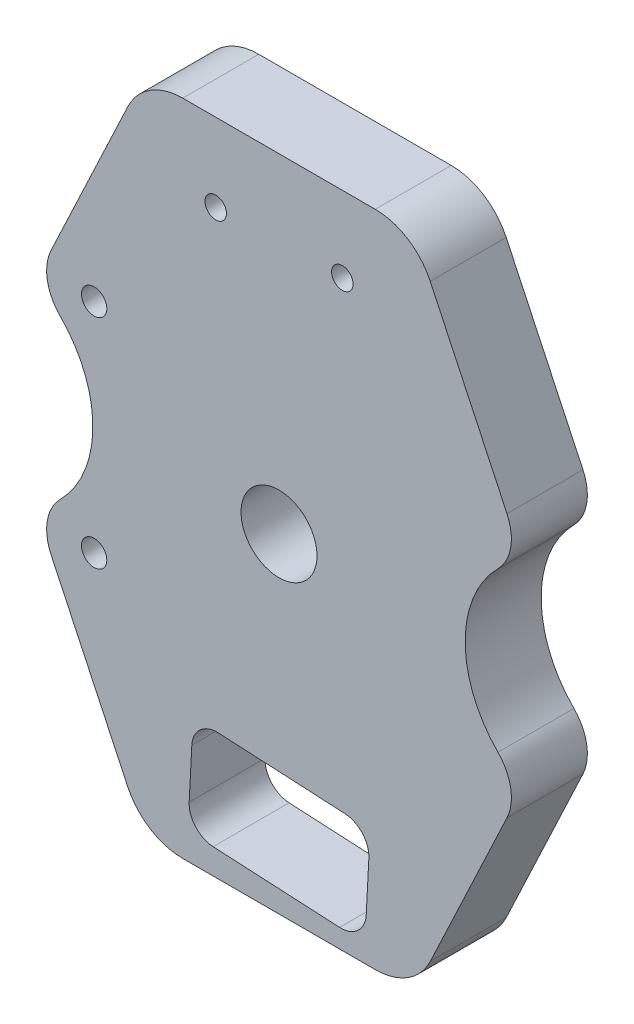
ISO-10303-21;
HEADER;
FILE_DESCRIPTION(('STEP AP214'),'2;1');
FILE_NAME('part.step','',(''),(''),'','','');
FILE_SCHEMA(('AUTOMOTIVE_DESIGN { 1 0 10303 214 1 1 1 1 }'));
ENDSEC;
DATA;
#1=APPLICATION_CONTEXT('core data for automotive mechanical design processes');
#2=APPLICATION_PROTOCOL_DEFINITION('international standard','automotive_design',2000,#1);
#3=PRODUCT_CONTEXT('',#1,'mechanical');
#4=PRODUCT('Part','Part','',(#3));
#5=PRODUCT_RELATED_PRODUCT_CATEGORY('part','',(#4));
#6=PRODUCT_DEFINITION_FORMATION('','',#4);
#7=PRODUCT_DEFINITION_CONTEXT('part definition',#1,'design');
#8=PRODUCT_DEFINITION('design','',#6,#7);
#9=PRODUCT_DEFINITION_SHAPE('','',#8);
#10=(LENGTH_UNIT() NAMED_UNIT(*) SI_UNIT(.MILLI.,.METRE.));
#11=(NAMED_UNIT(*) PLANE_ANGLE_UNIT() SI_UNIT($,.RADIAN.));
#12=(NAMED_UNIT(*) SI_UNIT($,.STERADIAN.) SOLID_ANGLE_UNIT());
#13=UNCERTAINTY_MEASURE_WITH_UNIT(LENGTH_MEASURE(1.E-05),#10,'distance_accuracy_value','');
#14=(GEOMETRIC_REPRESENTATION_CONTEXT(3) GLOBAL_UNCERTAINTY_ASSIGNED_CONTEXT((#13)) GLOBAL_UNIT_ASSIGNED_CONTEXT((#10,
#11,#12)) REPRESENTATION_CONTEXT('',''));
#15=CARTESIAN_POINT('',(0.,0.,0.));
#16=DIRECTION('',(0.,0.,1.));
#17=DIRECTION('',(1.,0.,0.));
#18=AXIS2_PLACEMENT_3D('',#15,#16,#17);
#19=CARTESIAN_POINT('',(38.0693004201398,23.9998999467089,30.));
#20=DIRECTION('',(0.,0.,-1.));
#21=DIRECTION('',(-1.,0.,0.));
#22=AXIS2_PLACEMENT_3D('',#19,#20,#21);
#23=PLANE('',#22);
#24=DIRECTION('',(-0.998629534754574,0.0523359562429441,0.));
#25=VECTOR('',#24,1.);
#26=CARTESIAN_POINT('',(-35.998752841269,10.5489732913392,30.));
#27=LINE('',#26,#25);
#28=CARTESIAN_POINT('',(23.9190192440055,7.4088159167626,30.));
#29=VERTEX_POINT('',#28);
#30=CARTESIAN_POINT('',(-26.0124574937233,10.0256137289098,30.));
#31=VERTEX_POINT('',#30);
#32=EDGE_CURVE('E373',#29,#31,#27,.T.);
#33=ORIENTED_EDGE('',*,*,#32,.T.);
#34=CARTESIAN_POINT('',(-25.4890979312938,20.0119090764555,30.));
#35=DIRECTION('',(0.,0.,-1.));
#36=DIRECTION('',(-1.,0.,0.));
#37=AXIS2_PLACEMENT_3D('',#34,#35,#36);
#38=CIRCLE('',#37,10.);
#39=CARTESIAN_POINT('',(-35.4753932788395,20.535268638885,30.));
#40=VERTEX_POINT('',#39);
#41=EDGE_CURVE('E346',#31,#40,#38,.T.);
#42=ORIENTED_EDGE('',*,*,#41,.T.);
#43=DIRECTION('',(0.0523359562429445,0.998629534754574,0.));
#44=VECTOR('',#43,1.);
#45=CARTESIAN_POINT('',(-33.9053145915512,50.4941546815222,30.));
#46=LINE('',#45,#44);
#47=CARTESIAN_POINT('',(-34.4286741539807,40.5078593339764,30.));
#48=VERTEX_POINT('',#47);
#49=EDGE_CURVE('E375',#40,#48,#46,.T.);
#50=ORIENTED_EDGE('',*,*,#49,.T.);
#51=CARTESIAN_POINT('',(-24.4423788064349,39.984499771547,30.));
#52=DIRECTION('',(0.,0.,-1.));
#53=DIRECTION('',(-1.,0.,0.));
#54=AXIS2_PLACEMENT_3D('',#51,#52,#53);
#55=CIRCLE('',#54,10.);
#56=CARTESIAN_POINT('',(-23.9190192440055,49.9707951190927,30.));
#57=VERTEX_POINT('',#56);
#58=EDGE_CURVE('E54',#48,#57,#55,.T.);
#59=ORIENTED_EDGE('',*,*,#58,.T.);
#60=DIRECTION('',(0.998629534754574,-0.0523359562429446,0.));
#61=VECTOR('',#60,1.);
#62=CARTESIAN_POINT('',(35.998752841269,46.830637744516,30.));
#63=LINE('',#62,#61);
#64=CARTESIAN_POINT('',(26.0124574937232,47.3539973069455,30.));
#65=VERTEX_POINT('',#64);
#66=EDGE_CURVE('E369',#57,#65,#63,.T.);
#67=ORIENTED_EDGE('',*,*,#66,.T.);
#68=CARTESIAN_POINT('',(25.4890979312938,37.3677019593998,30.));
#69=DIRECTION('',(0.,0.,-1.));
#70=DIRECTION('',(-1.,0.,0.));
#71=AXIS2_PLACEMENT_3D('',#68,#69,#70);
#72=CIRCLE('',#71,10.);
#73=CARTESIAN_POINT('',(35.4753932788395,36.8443423969703,30.));
#74=VERTEX_POINT('',#73);
#75=EDGE_CURVE('E11',#65,#74,#72,.T.);
#76=ORIENTED_EDGE('',*,*,#75,.T.);
#77=DIRECTION('',(-0.0523359562429445,-0.998629534754574,0.));
#78=VECTOR('',#77,1.);
#79=CARTESIAN_POINT('',(35.998752841269,46.830637744516,30.));
#80=LINE('',#79,#78);
#81=CARTESIAN_POINT('',(34.4286741539806,16.8717517018789,30.));
#82=VERTEX_POINT('',#81);
#83=EDGE_CURVE('E367',#74,#82,#80,.T.);
#84=ORIENTED_EDGE('',*,*,#83,.T.);
#85=CARTESIAN_POINT('',(24.4423788064349,17.3951112643083,30.));
#86=DIRECTION('',(0.,0.,-1.));
#87=DIRECTION('',(-1.,0.,0.));
#88=AXIS2_PLACEMENT_3D('',#85,#86,#87);
#89=CIRCLE('',#88,10.);
#90=EDGE_CURVE('E342',#82,#29,#89,.T.);
#91=ORIENTED_EDGE('',*,*,#90,.T.);
#92=EDGE_LOOP('',(#33,#42,#50,#59,#67,#76,#84,#91));
#93=FACE_BOUND('',#92,.T.);
#94=DIRECTION('',(1.,-1.29580053179329E-13,0.));
#95=VECTOR('',#94,1.);
#96=CARTESIAN_POINT('',(-38.,4.92404202081449E-12,30.));
#97=LINE('',#96,#95);
#98=CARTESIAN_POINT('',(-38.,5.25274268525777E-12,30.));
#99=VERTEX_POINT('',#98);
#100=CARTESIAN_POINT('',(38.0000000000001,5.61581336988582E-12,30.));
#101=VERTEX_POINT('',#100);
#102=EDGE_CURVE('E193',#99,#101,#97,.T.);
#103=ORIENTED_EDGE('',*,*,#102,.T.);
#104=CARTESIAN_POINT('',(38.0693004201398,23.9998999467089,30.));
#105=DIRECTION('',(0.,0.,1.));
#106=DIRECTION('',(-1.,0.,0.));
#107=AXIS2_PLACEMENT_3D('',#104,#105,#106);
#108=CIRCLE('',#107,24.);
#109=CARTESIAN_POINT('',(59.7661609006696,13.7409406774445,30.));
#110=VERTEX_POINT('',#109);
#111=EDGE_CURVE('E197',#101,#110,#108,.T.);
#112=ORIENTED_EDGE('',*,*,#111,.T.);
#113=DIRECTION('',(0.426346779523004,0.904559795475326,0.));
#114=VECTOR('',#113,1.);
#115=CARTESIAN_POINT('',(59.7661609006696,13.7409406774445,30.));
#116=LINE('',#115,#114);
#117=CARTESIAN_POINT('',(90.0082162674247,77.904079068946,30.));
#118=VERTEX_POINT('',#117);
#119=EDGE_CURVE('E218',#110,#118,#116,.T.);
#120=ORIENTED_EDGE('',*,*,#119,.T.);
#121=CARTESIAN_POINT('',(73.5,85.6849077952408,30.));
#122=DIRECTION('',(0.,0.,1.));
#123=DIRECTION('',(-1.,0.,0.));
#124=AXIS2_PLACEMENT_3D('',#121,#122,#123);
#125=CIRCLE('',#124,18.25);
#126=CARTESIAN_POINT('',(86.4422244101156,98.5519714586494,30.));
#127=VERTEX_POINT('',#126);
#128=EDGE_CURVE('E220',#118,#127,#125,.T.);
#129=ORIENTED_EDGE('',*,*,#128,.T.);
#130=CARTESIAN_POINT('',(117.999977081356,129.926455459837,30.));
#131=DIRECTION('',(0.,0.,-1.));
#132=DIRECTION('',(1.,0.,0.));
#133=AXIS2_PLACEMENT_3D('',#130,#131,#132);
#134=CIRCLE('',#133,44.5);
#135=CARTESIAN_POINT('',(86.4422244101156,161.300939461025,30.));
#136=VERTEX_POINT('',#135);
#137=EDGE_CURVE('E225',#127,#136,#134,.T.);
#138=ORIENTED_EDGE('',*,*,#137,.T.);
#139=CARTESIAN_POINT('',(73.5,174.168003124434,30.));
#140=DIRECTION('',(0.,0.,1.));
#141=DIRECTION('',(1.,0.,0.));
#142=AXIS2_PLACEMENT_3D('',#139,#140,#141);
#143=CIRCLE('',#142,18.25);
#144=CARTESIAN_POINT('',(90.0082162674247,181.948831850729,30.));
#145=VERTEX_POINT('',#144);
#146=EDGE_CURVE('E227',#136,#145,#143,.T.);
#147=ORIENTED_EDGE('',*,*,#146,.T.);
#148=DIRECTION('',(-0.426346779523004,0.904559795475326,0.));
#149=VECTOR('',#148,1.);
#150=CARTESIAN_POINT('',(59.7094350914078,246.232322708552,30.));
#151=LINE('',#150,#149);
#152=CARTESIAN_POINT('',(59.7094350914078,246.232322708552,30.));
#153=VERTEX_POINT('',#152);
#154=EDGE_CURVE('E229',#145,#153,#151,.T.);
#155=ORIENTED_EDGE('',*,*,#154,.T.);
#156=CARTESIAN_POINT('',(38.,236.,30.));
#157=DIRECTION('',(0.,0.,1.));
#158=DIRECTION('',(1.,0.,0.));
#159=AXIS2_PLACEMENT_3D('',#156,#157,#158);
#160=CIRCLE('',#159,24.);
#161=CARTESIAN_POINT('',(38.,260.,30.));
#162=VERTEX_POINT('',#161);
#163=EDGE_CURVE('E231',#153,#162,#160,.T.);
#164=ORIENTED_EDGE('',*,*,#163,.T.);
#165=DIRECTION('',(-1.,0.,0.));
#166=VECTOR('',#165,1.);
#167=CARTESIAN_POINT('',(-38.,260.,30.));
#168=LINE('',#167,#166);
#169=CARTESIAN_POINT('',(-38.,260.,30.));
#170=VERTEX_POINT('',#169);
#171=EDGE_CURVE('E233',#162,#170,#168,.T.);
#172=ORIENTED_EDGE('',*,*,#171,.T.);
#173=CARTESIAN_POINT('',(-38.,236.,30.));
#174=DIRECTION('',(0.,0.,1.));
#175=DIRECTION('',(-1.,0.,0.));
#176=AXIS2_PLACEMENT_3D('',#173,#174,#175);
#177=CIRCLE('',#176,24.);
#178=CARTESIAN_POINT('',(-59.7094350914078,246.232322708552,30.));
#179=VERTEX_POINT('',#178);
#180=EDGE_CURVE('E235',#170,#179,#177,.T.);
#181=ORIENTED_EDGE('',*,*,#180,.T.);
#182=DIRECTION('',(-0.426346779523004,-0.904559795475326,0.));
#183=VECTOR('',#182,1.);
#184=CARTESIAN_POINT('',(-59.7094350914078,246.232322708552,30.));
#185=LINE('',#184,#183);
#186=CARTESIAN_POINT('',(-90.0082162674247,181.948831850729,30.));
#187=VERTEX_POINT('',#186);
#188=EDGE_CURVE('E237',#179,#187,#185,.T.);
#189=ORIENTED_EDGE('',*,*,#188,.T.);
#190=CARTESIAN_POINT('',(-73.5,174.168003124434,30.));
#191=DIRECTION('',(0.,0.,1.));
#192=DIRECTION('',(-1.,0.,0.));
#193=AXIS2_PLACEMENT_3D('',#190,#191,#192);
#194=CIRCLE('',#193,18.25);
#195=CARTESIAN_POINT('',(-86.4422244101156,161.300939461025,30.));
#196=VERTEX_POINT('',#195);
#197=EDGE_CURVE('E239',#187,#196,#194,.T.);
#198=ORIENTED_EDGE('',*,*,#197,.T.);
#199=CARTESIAN_POINT('',(-117.999977081356,129.926455459837,30.));
#200=DIRECTION('',(0.,0.,-1.));
#201=DIRECTION('',(-1.,0.,0.));
#202=AXIS2_PLACEMENT_3D('',#199,#200,#201);
#203=CIRCLE('',#202,44.5);
#204=CARTESIAN_POINT('',(-86.4422244101156,98.5519714586494,30.));
#205=VERTEX_POINT('',#204);
#206=EDGE_CURVE('E241',#196,#205,#203,.T.);
#207=ORIENTED_EDGE('',*,*,#206,.T.);
#208=CARTESIAN_POINT('',(-73.5,85.6849077952408,30.));
#209=DIRECTION('',(0.,0.,1.));
#210=DIRECTION('',(1.,0.,0.));
#211=AXIS2_PLACEMENT_3D('',#208,#209,#210);
#212=CIRCLE('',#211,18.25);
#213=CARTESIAN_POINT('',(-90.0082162674247,77.904079068946,30.));
#214=VERTEX_POINT('',#213);
#215=EDGE_CURVE('E243',#205,#214,#212,.T.);
#216=ORIENTED_EDGE('',*,*,#215,.T.);
#217=DIRECTION('',(0.426346779523004,-0.904559795475326,0.));
#218=VECTOR('',#217,1.);
#219=CARTESIAN_POINT('',(-59.7661609006695,13.7409406774445,30.));
#220=LINE('',#219,#218);
#221=CARTESIAN_POINT('',(-59.7661609006695,13.7409406774445,30.));
#222=VERTEX_POINT('',#221);
#223=EDGE_CURVE('E245',#214,#222,#220,.T.);
#224=ORIENTED_EDGE('',*,*,#223,.T.);
#225=CARTESIAN_POINT('',(-38.0693004201397,23.9998999467089,30.));
#226=DIRECTION('',(0.,0.,1.));
#227=DIRECTION('',(1.,0.,0.));
#228=AXIS2_PLACEMENT_3D('',#225,#226,#227);
#229=CIRCLE('',#228,24.0000000000003);
#230=EDGE_CURVE('E200',#222,#99,#229,.T.);
#231=ORIENTED_EDGE('',*,*,#230,.T.);
#232=EDGE_LOOP('',(#103,#112,#120,#129,#138,#147,#155,#164,#172,#181,#189,#198,#207,#216,#224,#231));
#233=FACE_BOUND('',#232,.T.);
#234=CARTESIAN_POINT('',(0.,130.,30.));
#235=DIRECTION('',(0.,0.,1.));
#236=DIRECTION('',(1.,0.,0.));
#237=AXIS2_PLACEMENT_3D('',#234,#235,#236);
#238=CIRCLE('',#237,15.);
#239=CARTESIAN_POINT('',(15.,130.,30.));
#240=VERTEX_POINT('',#239);
#241=EDGE_CURVE('E251',#240,#240,#238,.T.);
#242=ORIENTED_EDGE('',*,*,#241,.F.);
#243=EDGE_LOOP('',(#242));
#244=FACE_BOUND('',#243,.T.);
#245=CARTESIAN_POINT('',(-73.,173.,30.));
#246=DIRECTION('',(0.,0.,1.));
#247=DIRECTION('',(-1.,0.,0.));
#248=AXIS2_PLACEMENT_3D('',#245,#246,#247);
#249=CIRCLE('',#248,5.00000000000001);
#250=CARTESIAN_POINT('',(-78.,173.,30.));
#251=VERTEX_POINT('',#250);
#252=EDGE_CURVE('E406',#251,#251,#249,.T.);
#253=ORIENTED_EDGE('',*,*,#252,.F.);
#254=EDGE_LOOP('',(#253));
#255=FACE_BOUND('',#254,.T.);
#256=CARTESIAN_POINT('',(-73.,87.,30.));
#257=DIRECTION('',(0.,0.,1.));
#258=DIRECTION('',(1.,0.,0.));
#259=AXIS2_PLACEMENT_3D('',#256,#257,#258);
#260=CIRCLE('',#259,5.00000000000001);
#261=CARTESIAN_POINT('',(-68.,87.,30.));
#262=VERTEX_POINT('',#261);
#263=EDGE_CURVE('E400',#262,#262,#260,.T.);
#264=ORIENTED_EDGE('',*,*,#263,.F.);
#265=EDGE_LOOP('',(#264));
#266=FACE_BOUND('',#265,.T.);
#267=CARTESIAN_POINT('',(-24.9923847578196,229.127379678136,30.));
#268=DIRECTION('',(0.,0.,1.));
#269=DIRECTION('',(1.,0.,0.));
#270=AXIS2_PLACEMENT_3D('',#267,#268,#269);
#271=CIRCLE('',#270,4.25);
#272=CARTESIAN_POINT('',(-20.7423847578196,229.127379678136,30.));
#273=VERTEX_POINT('',#272);
#274=EDGE_CURVE('E394',#273,#273,#271,.T.);
#275=ORIENTED_EDGE('',*,*,#274,.F.);
#276=EDGE_LOOP('',(#275));
#277=FACE_BOUND('',#276,.T.);
#278=CARTESIAN_POINT('',(25.,230.,30.));
#279=DIRECTION('',(0.,0.,1.));
#280=DIRECTION('',(1.,0.,0.));
#281=AXIS2_PLACEMENT_3D('',#278,#279,#280);
#282=CIRCLE('',#281,4.25);
#283=CARTESIAN_POINT('',(29.25,230.,30.));
#284=VERTEX_POINT('',#283);
#285=EDGE_CURVE('E388',#284,#284,#282,.T.);
#286=ORIENTED_EDGE('',*,*,#285,.F.);
#287=EDGE_LOOP('',(#286));
#288=FACE_BOUND('',#287,.T.);
#289=ADVANCED_FACE('F32',(#93,#233,#244,#255,#266,#277,#288),#23,.F.);
#290=CARTESIAN_POINT('',(38.0693004201398,23.9998999467089,0.));
#291=DIRECTION('',(0.,0.,-1.));
#292=DIRECTION('',(-1.,0.,0.));
#293=AXIS2_PLACEMENT_3D('',#290,#291,#292);
#294=PLANE('',#293);
#295=DIRECTION('',(0.998629534754574,-0.0523359562429446,0.));
#296=VECTOR('',#295,1.);
#297=CARTESIAN_POINT('',(35.998752841269,46.830637744516,0.));
#298=LINE('',#297,#296);
#299=CARTESIAN_POINT('',(-23.9190192440055,49.9707951190927,0.));
#300=VERTEX_POINT('',#299);
#301=CARTESIAN_POINT('',(26.0124574937232,47.3539973069455,0.));
#302=VERTEX_POINT('',#301);
#303=EDGE_CURVE('E355',#300,#302,#298,.T.);
#304=ORIENTED_EDGE('',*,*,#303,.F.);
#305=CARTESIAN_POINT('',(-24.4423788064349,39.984499771547,0.));
#306=DIRECTION('',(0.,0.,-1.));
#307=DIRECTION('',(-1.,0.,0.));
#308=AXIS2_PLACEMENT_3D('',#305,#306,#307);
#309=CIRCLE('',#308,10.);
#310=CARTESIAN_POINT('',(-34.4286741539807,40.5078593339764,0.));
#311=VERTEX_POINT('',#310);
#312=EDGE_CURVE('E348',#300,#311,#309,.F.);
#313=ORIENTED_EDGE('',*,*,#312,.T.);
#314=DIRECTION('',(0.0523359562429445,0.998629534754574,0.));
#315=VECTOR('',#314,1.);
#316=CARTESIAN_POINT('',(-33.9053145915512,50.4941546815222,0.));
#317=LINE('',#316,#315);
#318=CARTESIAN_POINT('',(-35.4753932788395,20.535268638885,0.));
#319=VERTEX_POINT('',#318);
#320=EDGE_CURVE('E377',#319,#311,#317,.T.);
#321=ORIENTED_EDGE('',*,*,#320,.F.);
#322=CARTESIAN_POINT('',(-25.4890979312938,20.0119090764555,0.));
#323=DIRECTION('',(0.,0.,-1.));
#324=DIRECTION('',(-1.,0.,0.));
#325=AXIS2_PLACEMENT_3D('',#322,#323,#324);
#326=CIRCLE('',#325,10.);
#327=CARTESIAN_POINT('',(-26.0124574937233,10.0256137289098,0.));
#328=VERTEX_POINT('',#327);
#329=EDGE_CURVE('E344',#319,#328,#326,.F.);
#330=ORIENTED_EDGE('',*,*,#329,.T.);
#331=DIRECTION('',(-0.998629534754574,0.0523359562429441,0.));
#332=VECTOR('',#331,1.);
#333=CARTESIAN_POINT('',(-35.998752841269,10.5489732913392,0.));
#334=LINE('',#333,#332);
#335=CARTESIAN_POINT('',(23.9190192440055,7.4088159167626,0.));
#336=VERTEX_POINT('',#335);
#337=EDGE_CURVE('E383',#336,#328,#334,.T.);
#338=ORIENTED_EDGE('',*,*,#337,.F.);
#339=CARTESIAN_POINT('',(24.4423788064349,17.3951112643083,0.));
#340=DIRECTION('',(0.,0.,-1.));
#341=DIRECTION('',(-1.,0.,0.));
#342=AXIS2_PLACEMENT_3D('',#339,#340,#341);
#343=CIRCLE('',#342,10.);
#344=CARTESIAN_POINT('',(34.4286741539806,16.8717517018789,0.));
#345=VERTEX_POINT('',#344);
#346=EDGE_CURVE('E340',#336,#345,#343,.F.);
#347=ORIENTED_EDGE('',*,*,#346,.T.);
#348=DIRECTION('',(-0.0523359562429445,-0.998629534754574,0.));
#349=VECTOR('',#348,1.);
#350=CARTESIAN_POINT('',(35.998752841269,46.830637744516,0.));
#351=LINE('',#350,#349);
#352=CARTESIAN_POINT('',(35.4753932788395,36.8443423969703,0.));
#353=VERTEX_POINT('',#352);
#354=EDGE_CURVE('E357',#353,#345,#351,.T.);
#355=ORIENTED_EDGE('',*,*,#354,.F.);
#356=CARTESIAN_POINT('',(25.4890979312938,37.3677019593998,0.));
#357=DIRECTION('',(0.,0.,-1.));
#358=DIRECTION('',(-1.,0.,0.));
#359=AXIS2_PLACEMENT_3D('',#356,#357,#358);
#360=CIRCLE('',#359,10.);
#361=EDGE_CURVE('E40',#353,#302,#360,.F.);
#362=ORIENTED_EDGE('',*,*,#361,.T.);
#363=EDGE_LOOP('',(#304,#313,#321,#330,#338,#347,#355,#362));
#364=FACE_BOUND('',#363,.T.);
#365=CARTESIAN_POINT('',(-24.9923847578196,229.127379678136,0.));
#366=DIRECTION('',(0.,0.,1.));
#367=DIRECTION('',(1.,0.,0.));
#368=AXIS2_PLACEMENT_3D('',#365,#366,#367);
#369=CIRCLE('',#368,4.25);
#370=CARTESIAN_POINT('',(-20.7423847578196,229.127379678136,0.));
#371=VERTEX_POINT('',#370);
#372=EDGE_CURVE('E391',#371,#371,#369,.T.);
#373=ORIENTED_EDGE('',*,*,#372,.T.);
#374=EDGE_LOOP('',(#373));
#375=FACE_BOUND('',#374,.T.);
#376=CARTESIAN_POINT('',(-73.,173.,0.));
#377=DIRECTION('',(0.,0.,1.));
#378=DIRECTION('',(-1.,0.,0.));
#379=AXIS2_PLACEMENT_3D('',#376,#377,#378);
#380=CIRCLE('',#379,5.00000000000001);
#381=CARTESIAN_POINT('',(-78.,173.,0.));
#382=VERTEX_POINT('',#381);
#383=EDGE_CURVE('E403',#382,#382,#380,.T.);
#384=ORIENTED_EDGE('',*,*,#383,.T.);
#385=EDGE_LOOP('',(#384));
#386=FACE_BOUND('',#385,.T.);
#387=DIRECTION('',(1.,1.47784562365416E-13,0.));
#388=VECTOR('',#387,1.);
#389=CARTESIAN_POINT('',(0.,0.,0.));
#390=LINE('',#389,#388);
#391=CARTESIAN_POINT('',(-38.,5.25274268525777E-12,0.));
#392=VERTEX_POINT('',#391);
#393=CARTESIAN_POINT('',(38.0000000000001,5.61581336988582E-12,0.));
#394=VERTEX_POINT('',#393);
#395=EDGE_CURVE('E209',#392,#394,#390,.T.);
#396=ORIENTED_EDGE('',*,*,#395,.F.);
#397=CARTESIAN_POINT('',(-38.0693004201397,23.9998999467089,0.));
#398=DIRECTION('',(0.,0.,1.));
#399=DIRECTION('',(1.,0.,0.));
#400=AXIS2_PLACEMENT_3D('',#397,#398,#399);
#401=CIRCLE('',#400,24.0000000000003);
#402=CARTESIAN_POINT('',(-59.7661609006695,13.7409406774445,0.));
#403=VERTEX_POINT('',#402);
#404=EDGE_CURVE('E204',#403,#392,#401,.T.);
#405=ORIENTED_EDGE('',*,*,#404,.F.);
#406=DIRECTION('',(0.426346779523004,-0.904559795475326,0.));
#407=VECTOR('',#406,1.);
#408=CARTESIAN_POINT('',(-59.7661609006695,13.7409406774445,0.));
#409=LINE('',#408,#407);
#410=CARTESIAN_POINT('',(-90.0082162674247,77.904079068946,0.));
#411=VERTEX_POINT('',#410);
#412=EDGE_CURVE('E277',#411,#403,#409,.T.);
#413=ORIENTED_EDGE('',*,*,#412,.F.);
#414=CARTESIAN_POINT('',(-73.5,85.6849077952408,0.));
#415=DIRECTION('',(0.,0.,1.));
#416=DIRECTION('',(1.,0.,0.));
#417=AXIS2_PLACEMENT_3D('',#414,#415,#416);
#418=CIRCLE('',#417,18.25);
#419=CARTESIAN_POINT('',(-86.4422244101156,98.5519714586494,0.));
#420=VERTEX_POINT('',#419);
#421=EDGE_CURVE('E275',#420,#411,#418,.T.);
#422=ORIENTED_EDGE('',*,*,#421,.F.);
#423=CARTESIAN_POINT('',(-117.999977081356,129.926455459837,0.));
#424=DIRECTION('',(0.,0.,-1.));
#425=DIRECTION('',(-1.,0.,0.));
#426=AXIS2_PLACEMENT_3D('',#423,#424,#425);
#427=CIRCLE('',#426,44.5);
#428=CARTESIAN_POINT('',(-86.4422244101156,161.300939461025,0.));
#429=VERTEX_POINT('',#428);
#430=EDGE_CURVE('E273',#429,#420,#427,.T.);
#431=ORIENTED_EDGE('',*,*,#430,.F.);
#432=CARTESIAN_POINT('',(-73.5,174.168003124434,0.));
#433=DIRECTION('',(0.,0.,1.));
#434=DIRECTION('',(-1.,0.,0.));
#435=AXIS2_PLACEMENT_3D('',#432,#433,#434);
#436=CIRCLE('',#435,18.25);
#437=CARTESIAN_POINT('',(-90.0082162674247,181.948831850729,0.));
#438=VERTEX_POINT('',#437);
#439=EDGE_CURVE('E271',#438,#429,#436,.T.);
#440=ORIENTED_EDGE('',*,*,#439,.F.);
#441=DIRECTION('',(-0.426346779523004,-0.904559795475326,0.));
#442=VECTOR('',#441,1.);
#443=CARTESIAN_POINT('',(-59.7094350914078,246.232322708552,0.));
#444=LINE('',#443,#442);
#445=CARTESIAN_POINT('',(-59.7094350914078,246.232322708552,0.));
#446=VERTEX_POINT('',#445);
#447=EDGE_CURVE('E269',#446,#438,#444,.T.);
#448=ORIENTED_EDGE('',*,*,#447,.F.);
#449=CARTESIAN_POINT('',(-38.,236.,0.));
#450=DIRECTION('',(0.,0.,1.));
#451=DIRECTION('',(-1.,0.,0.));
#452=AXIS2_PLACEMENT_3D('',#449,#450,#451);
#453=CIRCLE('',#452,24.);
#454=CARTESIAN_POINT('',(-38.,260.,0.));
#455=VERTEX_POINT('',#454);
#456=EDGE_CURVE('E267',#455,#446,#453,.T.);
#457=ORIENTED_EDGE('',*,*,#456,.F.);
#458=DIRECTION('',(-1.,0.,0.));
#459=VECTOR('',#458,1.);
#460=CARTESIAN_POINT('',(-38.,260.,0.));
#461=LINE('',#460,#459);
#462=CARTESIAN_POINT('',(38.,260.,0.));
#463=VERTEX_POINT('',#462);
#464=EDGE_CURVE('E265',#463,#455,#461,.T.);
#465=ORIENTED_EDGE('',*,*,#464,.F.);
#466=CARTESIAN_POINT('',(38.,236.,0.));
#467=DIRECTION('',(0.,0.,1.));
#468=DIRECTION('',(1.,0.,0.));
#469=AXIS2_PLACEMENT_3D('',#466,#467,#468);
#470=CIRCLE('',#469,24.);
#471=CARTESIAN_POINT('',(59.7094350914078,246.232322708552,0.));
#472=VERTEX_POINT('',#471);
#473=EDGE_CURVE('E263',#472,#463,#470,.T.);
#474=ORIENTED_EDGE('',*,*,#473,.F.);
#475=DIRECTION('',(-0.426346779523004,0.904559795475326,0.));
#476=VECTOR('',#475,1.);
#477=CARTESIAN_POINT('',(59.7094350914078,246.232322708552,0.));
#478=LINE('',#477,#476);
#479=CARTESIAN_POINT('',(90.0082162674247,181.948831850729,0.));
#480=VERTEX_POINT('',#479);
#481=EDGE_CURVE('E261',#480,#472,#478,.T.);
#482=ORIENTED_EDGE('',*,*,#481,.F.);
#483=CARTESIAN_POINT('',(73.5,174.168003124434,0.));
#484=DIRECTION('',(0.,0.,1.));
#485=DIRECTION('',(1.,0.,0.));
#486=AXIS2_PLACEMENT_3D('',#483,#484,#485);
#487=CIRCLE('',#486,18.25);
#488=CARTESIAN_POINT('',(86.4422244101156,161.300939461025,0.));
#489=VERTEX_POINT('',#488);
#490=EDGE_CURVE('E259',#489,#480,#487,.T.);
#491=ORIENTED_EDGE('',*,*,#490,.F.);
#492=CARTESIAN_POINT('',(117.999977081356,129.926455459837,0.));
#493=DIRECTION('',(0.,0.,-1.));
#494=DIRECTION('',(1.,0.,0.));
#495=AXIS2_PLACEMENT_3D('',#492,#493,#494);
#496=CIRCLE('',#495,44.5);
#497=CARTESIAN_POINT('',(86.4422244101156,98.5519714586494,0.));
#498=VERTEX_POINT('',#497);
#499=EDGE_CURVE('E257',#498,#489,#496,.T.);
#500=ORIENTED_EDGE('',*,*,#499,.F.);
#501=CARTESIAN_POINT('',(73.5,85.6849077952408,0.));
#502=DIRECTION('',(0.,0.,1.));
#503=DIRECTION('',(-1.,0.,0.));
#504=AXIS2_PLACEMENT_3D('',#501,#502,#503);
#505=CIRCLE('',#504,18.25);
#506=CARTESIAN_POINT('',(90.0082162674247,77.904079068946,0.));
#507=VERTEX_POINT('',#506);
#508=EDGE_CURVE('E255',#507,#498,#505,.T.);
#509=ORIENTED_EDGE('',*,*,#508,.F.);
#510=DIRECTION('',(0.426346779523004,0.904559795475326,0.));
#511=VECTOR('',#510,1.);
#512=CARTESIAN_POINT('',(59.7661609006696,13.7409406774445,0.));
#513=LINE('',#512,#511);
#514=CARTESIAN_POINT('',(59.7661609006696,13.7409406774445,0.));
#515=VERTEX_POINT('',#514);
#516=EDGE_CURVE('E253',#515,#507,#513,.T.);
#517=ORIENTED_EDGE('',*,*,#516,.F.);
#518=CARTESIAN_POINT('',(38.0693004201398,23.9998999467089,0.));
#519=DIRECTION('',(0.,0.,1.));
#520=DIRECTION('',(-1.,0.,0.));
#521=AXIS2_PLACEMENT_3D('',#518,#519,#520);
#522=CIRCLE('',#521,24.);
#523=EDGE_CURVE('E250',#394,#515,#522,.T.);
#524=ORIENTED_EDGE('',*,*,#523,.F.);
#525=EDGE_LOOP('',(#396,#405,#413,#422,#431,#440,#448,#457,#465,#474,#482,#491,#500,#509,#517,#524));
#526=FACE_BOUND('',#525,.T.);
#527=CARTESIAN_POINT('',(0.,130.,0.));
#528=DIRECTION('',(0.,0.,1.));
#529=DIRECTION('',(1.,0.,0.));
#530=AXIS2_PLACEMENT_3D('',#527,#528,#529);
#531=CIRCLE('',#530,15.);
#532=CARTESIAN_POINT('',(15.,130.,0.));
#533=VERTEX_POINT('',#532);
#534=EDGE_CURVE('E409',#533,#533,#531,.T.);
#535=ORIENTED_EDGE('',*,*,#534,.T.);
#536=EDGE_LOOP('',(#535));
#537=FACE_BOUND('',#536,.T.);
#538=CARTESIAN_POINT('',(-73.,87.,0.));
#539=DIRECTION('',(0.,0.,1.));
#540=DIRECTION('',(1.,0.,0.));
#541=AXIS2_PLACEMENT_3D('',#538,#539,#540);
#542=CIRCLE('',#541,5.00000000000001);
#543=CARTESIAN_POINT('',(-68.,87.,0.));
#544=VERTEX_POINT('',#543);
#545=EDGE_CURVE('E397',#544,#544,#542,.T.);
#546=ORIENTED_EDGE('',*,*,#545,.T.);
#547=EDGE_LOOP('',(#546));
#548=FACE_BOUND('',#547,.T.);
#549=CARTESIAN_POINT('',(25.,230.,0.));
#550=DIRECTION('',(0.,0.,1.));
#551=DIRECTION('',(1.,0.,0.));
#552=AXIS2_PLACEMENT_3D('',#549,#550,#551);
#553=CIRCLE('',#552,4.25);
#554=CARTESIAN_POINT('',(29.25,230.,0.));
#555=VERTEX_POINT('',#554);
#556=EDGE_CURVE('E380',#555,#555,#553,.T.);
#557=ORIENTED_EDGE('',*,*,#556,.T.);
#558=EDGE_LOOP('',(#557));
#559=FACE_BOUND('',#558,.T.);
#560=ADVANCED_FACE('F353',(#364,#375,#386,#526,#537,#548,#559),#294,.T.);
#561=CARTESIAN_POINT('',(0.,0.,30.));
#562=DIRECTION('',(-1.47784562365416E-13,1.,0.));
#563=DIRECTION('',(-1.,-1.47784562365416E-13,0.));
#564=AXIS2_PLACEMENT_3D('',#561,#562,#563);
#565=PLANE('',#564);
#566=ORIENTED_EDGE('',*,*,#395,.T.);
#567=DIRECTION('',(0.,0.,-1.));
#568=VECTOR('',#567,1.);
#569=CARTESIAN_POINT('',(38.0000000000001,5.61581336988582E-12,30.));
#570=LINE('',#569,#568);
#571=EDGE_CURVE('E207',#101,#394,#570,.T.);
#572=ORIENTED_EDGE('',*,*,#571,.F.);
#573=ORIENTED_EDGE('',*,*,#102,.F.);
#574=DIRECTION('',(0.,0.,-1.));
#575=VECTOR('',#574,1.);
#576=CARTESIAN_POINT('',(-38.,5.25274268525777E-12,30.));
#577=LINE('',#576,#575);
#578=EDGE_CURVE('E248',#99,#392,#577,.T.);
#579=ORIENTED_EDGE('',*,*,#578,.T.);
#580=EDGE_LOOP('',(#566,#572,#573,#579));
#581=FACE_BOUND('',#580,.T.);
#582=ADVANCED_FACE('F208',(#581),#565,.F.);
#583=CARTESIAN_POINT('',(38.0693004201398,23.9998999467089,30.));
#584=DIRECTION('',(0.,0.,-1.));
#585=DIRECTION('',(-1.,0.,0.));
#586=AXIS2_PLACEMENT_3D('',#583,#584,#585);
#587=CYLINDRICAL_SURFACE('',#586,24.);
#588=ORIENTED_EDGE('',*,*,#523,.T.);
#589=DIRECTION('',(0.,0.,-1.));
#590=VECTOR('',#589,1.);
#591=CARTESIAN_POINT('',(59.7661609006696,13.7409406774445,30.));
#592=LINE('',#591,#590);
#593=EDGE_CURVE('E213',#110,#515,#592,.T.);
#594=ORIENTED_EDGE('',*,*,#593,.F.);
#595=ORIENTED_EDGE('',*,*,#111,.F.);
#596=ORIENTED_EDGE('',*,*,#571,.T.);
#597=EDGE_LOOP('',(#588,#594,#595,#596));
#598=FACE_BOUND('',#597,.T.);
#599=ADVANCED_FACE('F215',(#598),#587,.T.);
#600=CARTESIAN_POINT('',(59.7661609006696,13.7409406774445,30.));
#601=DIRECTION('',(-0.904559795475326,0.426346779523004,0.));
#602=DIRECTION('',(-0.426346779523004,-0.904559795475326,0.));
#603=AXIS2_PLACEMENT_3D('',#600,#601,#602);
#604=PLANE('',#603);
#605=ORIENTED_EDGE('',*,*,#516,.T.);
#606=DIRECTION('',(0.,0.,-1.));
#607=VECTOR('',#606,1.);
#608=CARTESIAN_POINT('',(90.0082162674247,77.904079068946,30.));
#609=LINE('',#608,#607);
#610=EDGE_CURVE('E318',#118,#507,#609,.T.);
#611=ORIENTED_EDGE('',*,*,#610,.F.);
#612=ORIENTED_EDGE('',*,*,#119,.F.);
#613=ORIENTED_EDGE('',*,*,#593,.T.);
#614=EDGE_LOOP('',(#605,#611,#612,#613));
#615=FACE_BOUND('',#614,.T.);
#616=ADVANCED_FACE('F487',(#615),#604,.F.);
#617=CARTESIAN_POINT('',(73.5,85.6849077952408,30.));
#618=DIRECTION('',(0.,0.,-1.));
#619=DIRECTION('',(-1.,0.,0.));
#620=AXIS2_PLACEMENT_3D('',#617,#618,#619);
#621=CYLINDRICAL_SURFACE('',#620,18.25);
#622=ORIENTED_EDGE('',*,*,#508,.T.);
#623=DIRECTION('',(0.,0.,-1.));
#624=VECTOR('',#623,1.);
#625=CARTESIAN_POINT('',(86.4422244101156,98.5519714586494,30.));
#626=LINE('',#625,#624);
#627=EDGE_CURVE('E315',#127,#498,#626,.T.);
#628=ORIENTED_EDGE('',*,*,#627,.F.);
#629=ORIENTED_EDGE('',*,*,#128,.F.);
#630=ORIENTED_EDGE('',*,*,#610,.T.);
#631=EDGE_LOOP('',(#622,#628,#629,#630));
#632=FACE_BOUND('',#631,.T.);
#633=ADVANCED_FACE('F483',(#632),#621,.T.);
#634=CARTESIAN_POINT('',(117.999977081356,129.926455459837,30.));
#635=DIRECTION('',(0.,0.,-1.));
#636=DIRECTION('',(-1.,0.,0.));
#637=AXIS2_PLACEMENT_3D('',#634,#635,#636);
#638=CYLINDRICAL_SURFACE('',#637,44.5);
#639=ORIENTED_EDGE('',*,*,#499,.T.);
#640=DIRECTION('',(0.,0.,-1.));
#641=VECTOR('',#640,1.);
#642=CARTESIAN_POINT('',(86.4422244101156,161.300939461025,30.));
#643=LINE('',#642,#641);
#644=EDGE_CURVE('E312',#136,#489,#643,.T.);
#645=ORIENTED_EDGE('',*,*,#644,.F.);
#646=ORIENTED_EDGE('',*,*,#137,.F.);
#647=ORIENTED_EDGE('',*,*,#627,.T.);
#648=EDGE_LOOP('',(#639,#645,#646,#647));
#649=FACE_BOUND('',#648,.T.);
#650=ADVANCED_FACE('F479',(#649),#638,.F.);
#651=CARTESIAN_POINT('',(73.5,174.168003124434,30.));
#652=DIRECTION('',(0.,0.,-1.));
#653=DIRECTION('',(-1.,0.,0.));
#654=AXIS2_PLACEMENT_3D('',#651,#652,#653);
#655=CYLINDRICAL_SURFACE('',#654,18.25);
#656=ORIENTED_EDGE('',*,*,#490,.T.);
#657=DIRECTION('',(0.,0.,-1.));
#658=VECTOR('',#657,1.);
#659=CARTESIAN_POINT('',(90.0082162674247,181.948831850729,30.));
#660=LINE('',#659,#658);
#661=EDGE_CURVE('E309',#145,#480,#660,.T.);
#662=ORIENTED_EDGE('',*,*,#661,.F.);
#663=ORIENTED_EDGE('',*,*,#146,.F.);
#664=ORIENTED_EDGE('',*,*,#644,.T.);
#665=EDGE_LOOP('',(#656,#662,#663,#664));
#666=FACE_BOUND('',#665,.T.);
#667=ADVANCED_FACE('F475',(#666),#655,.T.);
#668=CARTESIAN_POINT('',(59.7094350914078,246.232322708552,30.));
#669=DIRECTION('',(-0.904559795475326,-0.426346779523004,0.));
#670=DIRECTION('',(0.426346779523004,-0.904559795475326,0.));
#671=AXIS2_PLACEMENT_3D('',#668,#669,#670);
#672=PLANE('',#671);
#673=ORIENTED_EDGE('',*,*,#481,.T.);
#674=DIRECTION('',(0.,0.,-1.));
#675=VECTOR('',#674,1.);
#676=CARTESIAN_POINT('',(59.7094350914078,246.232322708552,30.));
#677=LINE('',#676,#675);
#678=EDGE_CURVE('E306',#153,#472,#677,.T.);
#679=ORIENTED_EDGE('',*,*,#678,.F.);
#680=ORIENTED_EDGE('',*,*,#154,.F.);
#681=ORIENTED_EDGE('',*,*,#661,.T.);
#682=EDGE_LOOP('',(#673,#679,#680,#681));
#683=FACE_BOUND('',#682,.T.);
#684=ADVANCED_FACE('F471',(#683),#672,.F.);
#685=CARTESIAN_POINT('',(38.,236.,30.));
#686=DIRECTION('',(0.,0.,-1.));
#687=DIRECTION('',(-1.,0.,0.));
#688=AXIS2_PLACEMENT_3D('',#685,#686,#687);
#689=CYLINDRICAL_SURFACE('',#688,24.);
#690=ORIENTED_EDGE('',*,*,#473,.T.);
#691=DIRECTION('',(0.,0.,-1.));
#692=VECTOR('',#691,1.);
#693=CARTESIAN_POINT('',(38.,260.,30.));
#694=LINE('',#693,#692);
#695=EDGE_CURVE('E303',#162,#463,#694,.T.);
#696=ORIENTED_EDGE('',*,*,#695,.F.);
#697=ORIENTED_EDGE('',*,*,#163,.F.);
#698=ORIENTED_EDGE('',*,*,#678,.T.);
#699=EDGE_LOOP('',(#690,#696,#697,#698));
#700=FACE_BOUND('',#699,.T.);
#701=ADVANCED_FACE('F467',(#700),#689,.T.);
#702=CARTESIAN_POINT('',(-38.,260.,30.));
#703=DIRECTION('',(0.,-1.,0.));
#704=DIRECTION('',(0.,0.,-1.));
#705=AXIS2_PLACEMENT_3D('',#702,#703,#704);
#706=PLANE('',#705);
#707=ORIENTED_EDGE('',*,*,#464,.T.);
#708=DIRECTION('',(0.,0.,-1.));
#709=VECTOR('',#708,1.);
#710=CARTESIAN_POINT('',(-38.,260.,30.));
#711=LINE('',#710,#709);
#712=EDGE_CURVE('E300',#170,#455,#711,.T.);
#713=ORIENTED_EDGE('',*,*,#712,.F.);
#714=ORIENTED_EDGE('',*,*,#171,.F.);
#715=ORIENTED_EDGE('',*,*,#695,.T.);
#716=EDGE_LOOP('',(#707,#713,#714,#715));
#717=FACE_BOUND('',#716,.T.);
#718=ADVANCED_FACE('F463',(#717),#706,.F.);
#719=CARTESIAN_POINT('',(-38.,236.,30.));
#720=DIRECTION('',(0.,0.,-1.));
#721=DIRECTION('',(-1.,0.,0.));
#722=AXIS2_PLACEMENT_3D('',#719,#720,#721);
#723=CYLINDRICAL_SURFACE('',#722,24.);
#724=ORIENTED_EDGE('',*,*,#456,.T.);
#725=DIRECTION('',(0.,0.,-1.));
#726=VECTOR('',#725,1.);
#727=CARTESIAN_POINT('',(-59.7094350914078,246.232322708552,30.));
#728=LINE('',#727,#726);
#729=EDGE_CURVE('E297',#179,#446,#728,.T.);
#730=ORIENTED_EDGE('',*,*,#729,.F.);
#731=ORIENTED_EDGE('',*,*,#180,.F.);
#732=ORIENTED_EDGE('',*,*,#712,.T.);
#733=EDGE_LOOP('',(#724,#730,#731,#732));
#734=FACE_BOUND('',#733,.T.);
#735=ADVANCED_FACE('F459',(#734),#723,.T.);
#736=CARTESIAN_POINT('',(-59.7094350914078,246.232322708552,30.));
#737=DIRECTION('',(0.904559795475326,-0.426346779523004,0.));
#738=DIRECTION('',(0.426346779523004,0.904559795475326,0.));
#739=AXIS2_PLACEMENT_3D('',#736,#737,#738);
#740=PLANE('',#739);
#741=ORIENTED_EDGE('',*,*,#447,.T.);
#742=DIRECTION('',(0.,0.,-1.));
#743=VECTOR('',#742,1.);
#744=CARTESIAN_POINT('',(-90.0082162674247,181.948831850729,30.));
#745=LINE('',#744,#743);
#746=EDGE_CURVE('E294',#187,#438,#745,.T.);
#747=ORIENTED_EDGE('',*,*,#746,.F.);
#748=ORIENTED_EDGE('',*,*,#188,.F.);
#749=ORIENTED_EDGE('',*,*,#729,.T.);
#750=EDGE_LOOP('',(#741,#747,#748,#749));
#751=FACE_BOUND('',#750,.T.);
#752=ADVANCED_FACE('F455',(#751),#740,.F.);
#753=CARTESIAN_POINT('',(-73.5,174.168003124434,30.));
#754=DIRECTION('',(0.,0.,-1.));
#755=DIRECTION('',(-1.,0.,0.));
#756=AXIS2_PLACEMENT_3D('',#753,#754,#755);
#757=CYLINDRICAL_SURFACE('',#756,18.25);
#758=ORIENTED_EDGE('',*,*,#439,.T.);
#759=DIRECTION('',(0.,0.,-1.));
#760=VECTOR('',#759,1.);
#761=CARTESIAN_POINT('',(-86.4422244101156,161.300939461025,30.));
#762=LINE('',#761,#760);
#763=EDGE_CURVE('E291',#196,#429,#762,.T.);
#764=ORIENTED_EDGE('',*,*,#763,.F.);
#765=ORIENTED_EDGE('',*,*,#197,.F.);
#766=ORIENTED_EDGE('',*,*,#746,.T.);
#767=EDGE_LOOP('',(#758,#764,#765,#766));
#768=FACE_BOUND('',#767,.T.);
#769=ADVANCED_FACE('F451',(#768),#757,.T.);
#770=CARTESIAN_POINT('',(-117.999977081356,129.926455459837,30.));
#771=DIRECTION('',(0.,0.,-1.));
#772=DIRECTION('',(-1.,0.,0.));
#773=AXIS2_PLACEMENT_3D('',#770,#771,#772);
#774=CYLINDRICAL_SURFACE('',#773,44.5);
#775=ORIENTED_EDGE('',*,*,#430,.T.);
#776=DIRECTION('',(0.,0.,-1.));
#777=VECTOR('',#776,1.);
#778=CARTESIAN_POINT('',(-86.4422244101156,98.5519714586494,30.));
#779=LINE('',#778,#777);
#780=EDGE_CURVE('E288',#205,#420,#779,.T.);
#781=ORIENTED_EDGE('',*,*,#780,.F.);
#782=ORIENTED_EDGE('',*,*,#206,.F.);
#783=ORIENTED_EDGE('',*,*,#763,.T.);
#784=EDGE_LOOP('',(#775,#781,#782,#783));
#785=FACE_BOUND('',#784,.T.);
#786=ADVANCED_FACE('F447',(#785),#774,.F.);
#787=CARTESIAN_POINT('',(-73.5,85.6849077952408,30.));
#788=DIRECTION('',(0.,0.,-1.));
#789=DIRECTION('',(-1.,0.,0.));
#790=AXIS2_PLACEMENT_3D('',#787,#788,#789);
#791=CYLINDRICAL_SURFACE('',#790,18.25);
#792=ORIENTED_EDGE('',*,*,#421,.T.);
#793=DIRECTION('',(0.,0.,-1.));
#794=VECTOR('',#793,1.);
#795=CARTESIAN_POINT('',(-90.0082162674247,77.904079068946,30.));
#796=LINE('',#795,#794);
#797=EDGE_CURVE('E285',#214,#411,#796,.T.);
#798=ORIENTED_EDGE('',*,*,#797,.F.);
#799=ORIENTED_EDGE('',*,*,#215,.F.);
#800=ORIENTED_EDGE('',*,*,#780,.T.);
#801=EDGE_LOOP('',(#792,#798,#799,#800));
#802=FACE_BOUND('',#801,.T.);
#803=ADVANCED_FACE('F443',(#802),#791,.T.);
#804=CARTESIAN_POINT('',(-59.7661609006695,13.7409406774445,30.));
#805=DIRECTION('',(0.904559795475326,0.426346779523004,0.));
#806=DIRECTION('',(-0.426346779523004,0.904559795475326,0.));
#807=AXIS2_PLACEMENT_3D('',#804,#805,#806);
#808=PLANE('',#807);
#809=ORIENTED_EDGE('',*,*,#412,.T.);
#810=DIRECTION('',(0.,0.,-1.));
#811=VECTOR('',#810,1.);
#812=CARTESIAN_POINT('',(-59.7661609006695,13.7409406774445,30.));
#813=LINE('',#812,#811);
#814=EDGE_CURVE('E282',#222,#403,#813,.T.);
#815=ORIENTED_EDGE('',*,*,#814,.F.);
#816=ORIENTED_EDGE('',*,*,#223,.F.);
#817=ORIENTED_EDGE('',*,*,#797,.T.);
#818=EDGE_LOOP('',(#809,#815,#816,#817));
#819=FACE_BOUND('',#818,.T.);
#820=ADVANCED_FACE('F431',(#819),#808,.F.);
#821=CARTESIAN_POINT('',(-38.0693004201397,23.9998999467089,30.));
#822=DIRECTION('',(0.,0.,-1.));
#823=DIRECTION('',(-1.,0.,0.));
#824=AXIS2_PLACEMENT_3D('',#821,#822,#823);
#825=CYLINDRICAL_SURFACE('',#824,24.0000000000003);
#826=ORIENTED_EDGE('',*,*,#404,.T.);
#827=ORIENTED_EDGE('',*,*,#578,.F.);
#828=ORIENTED_EDGE('',*,*,#230,.F.);
#829=ORIENTED_EDGE('',*,*,#814,.T.);
#830=EDGE_LOOP('',(#826,#827,#828,#829));
#831=FACE_BOUND('',#830,.T.);
#832=ADVANCED_FACE('F421',(#831),#825,.T.);
#833=CARTESIAN_POINT('',(0.,130.,30.));
#834=DIRECTION('',(0.,0.,-1.));
#835=DIRECTION('',(-1.,0.,0.));
#836=AXIS2_PLACEMENT_3D('',#833,#834,#835);
#837=CYLINDRICAL_SURFACE('',#836,15.);
#838=ORIENTED_EDGE('',*,*,#241,.T.);
#839=EDGE_LOOP('',(#838));
#840=FACE_BOUND('',#839,.T.);
#841=ORIENTED_EDGE('',*,*,#534,.F.);
#842=EDGE_LOOP('',(#841));
#843=FACE_BOUND('',#842,.T.);
#844=ADVANCED_FACE('F418',(#840,#843),#837,.F.);
#845=CARTESIAN_POINT('',(-73.,173.,30.));
#846=DIRECTION('',(0.,0.,-1.));
#847=DIRECTION('',(-1.,0.,0.));
#848=AXIS2_PLACEMENT_3D('',#845,#846,#847);
#849=CYLINDRICAL_SURFACE('',#848,5.00000000000001);
#850=ORIENTED_EDGE('',*,*,#252,.T.);
#851=EDGE_LOOP('',(#850));
#852=FACE_BOUND('',#851,.T.);
#853=ORIENTED_EDGE('',*,*,#383,.F.);
#854=EDGE_LOOP('',(#853));
#855=FACE_BOUND('',#854,.T.);
#856=ADVANCED_FACE('F420',(#852,#855),#849,.F.);
#857=CARTESIAN_POINT('',(-73.,87.,30.));
#858=DIRECTION('',(0.,0.,-1.));
#859=DIRECTION('',(-1.,0.,0.));
#860=AXIS2_PLACEMENT_3D('',#857,#858,#859);
#861=CYLINDRICAL_SURFACE('',#860,5.00000000000001);
#862=ORIENTED_EDGE('',*,*,#263,.T.);
#863=EDGE_LOOP('',(#862));
#864=FACE_BOUND('',#863,.T.);
#865=ORIENTED_EDGE('',*,*,#545,.F.);
#866=EDGE_LOOP('',(#865));
#867=FACE_BOUND('',#866,.T.);
#868=ADVANCED_FACE('F428',(#864,#867),#861,.F.);
#869=CARTESIAN_POINT('',(-24.9923847578196,229.127379678136,30.));
#870=DIRECTION('',(0.,0.,-1.));
#871=DIRECTION('',(-1.,0.,0.));
#872=AXIS2_PLACEMENT_3D('',#869,#870,#871);
#873=CYLINDRICAL_SURFACE('',#872,4.25);
#874=ORIENTED_EDGE('',*,*,#274,.T.);
#875=EDGE_LOOP('',(#874));
#876=FACE_BOUND('',#875,.T.);
#877=ORIENTED_EDGE('',*,*,#372,.F.);
#878=EDGE_LOOP('',(#877));
#879=FACE_BOUND('',#878,.T.);
#880=ADVANCED_FACE('F536',(#876,#879),#873,.F.);
#881=CARTESIAN_POINT('',(25.,230.,30.));
#882=DIRECTION('',(0.,0.,-1.));
#883=DIRECTION('',(-1.,0.,0.));
#884=AXIS2_PLACEMENT_3D('',#881,#882,#883);
#885=CYLINDRICAL_SURFACE('',#884,4.25);
#886=ORIENTED_EDGE('',*,*,#285,.T.);
#887=EDGE_LOOP('',(#886));
#888=FACE_BOUND('',#887,.T.);
#889=ORIENTED_EDGE('',*,*,#556,.F.);
#890=EDGE_LOOP('',(#889));
#891=FACE_BOUND('',#890,.T.);
#892=ADVANCED_FACE('F533',(#888,#891),#885,.F.);
#893=CARTESIAN_POINT('',(35.998752841269,46.830637744516,30.));
#894=DIRECTION('',(0.0523359562429446,0.998629534754574,0.));
#895=DIRECTION('',(-0.998629534754574,0.0523359562429446,0.));
#896=AXIS2_PLACEMENT_3D('',#893,#894,#895);
#897=PLANE('',#896);
#898=ORIENTED_EDGE('',*,*,#66,.F.);
#899=DIRECTION('',(0.,0.,-1.));
#900=VECTOR('',#899,1.);
#901=CARTESIAN_POINT('',(-23.9190192440055,49.9707951190927,0.));
#902=LINE('',#901,#900);
#903=EDGE_CURVE('E337',#57,#300,#902,.T.);
#904=ORIENTED_EDGE('',*,*,#903,.T.);
#905=ORIENTED_EDGE('',*,*,#303,.T.);
#906=DIRECTION('',(0.,0.,-1.));
#907=VECTOR('',#906,1.);
#908=CARTESIAN_POINT('',(26.0124574937232,47.3539973069455,30.));
#909=LINE('',#908,#907);
#910=EDGE_CURVE('E47',#302,#65,#909,.F.);
#911=ORIENTED_EDGE('',*,*,#910,.T.);
#912=EDGE_LOOP('',(#898,#904,#905,#911));
#913=FACE_BOUND('',#912,.T.);
#914=ADVANCED_FACE('F360',(#913),#897,.F.);
#915=CARTESIAN_POINT('',(-33.9053145915512,50.4941546815222,30.));
#916=DIRECTION('',(-0.998629534754574,0.0523359562429445,0.));
#917=DIRECTION('',(-0.0523359562429445,-0.998629534754574,0.));
#918=AXIS2_PLACEMENT_3D('',#915,#916,#917);
#919=PLANE('',#918);
#920=ORIENTED_EDGE('',*,*,#49,.F.);
#921=DIRECTION('',(0.,0.,-1.));
#922=VECTOR('',#921,1.);
#923=CARTESIAN_POINT('',(-35.4753932788395,20.535268638885,0.));
#924=LINE('',#923,#922);
#925=EDGE_CURVE('E333',#40,#319,#924,.T.);
#926=ORIENTED_EDGE('',*,*,#925,.T.);
#927=ORIENTED_EDGE('',*,*,#320,.T.);
#928=DIRECTION('',(0.,0.,-1.));
#929=VECTOR('',#928,1.);
#930=CARTESIAN_POINT('',(-34.4286741539807,40.5078593339764,30.));
#931=LINE('',#930,#929);
#932=EDGE_CURVE('E331',#311,#48,#931,.F.);
#933=ORIENTED_EDGE('',*,*,#932,.T.);
#934=EDGE_LOOP('',(#920,#926,#927,#933));
#935=FACE_BOUND('',#934,.T.);
#936=ADVANCED_FACE('F513',(#935),#919,.F.);
#937=CARTESIAN_POINT('',(-35.998752841269,10.5489732913392,30.));
#938=DIRECTION('',(-0.0523359562429441,-0.998629534754574,0.));
#939=DIRECTION('',(0.998629534754574,-0.0523359562429441,0.));
#940=AXIS2_PLACEMENT_3D('',#937,#938,#939);
#941=PLANE('',#940);
#942=ORIENTED_EDGE('',*,*,#32,.F.);
#943=DIRECTION('',(0.,0.,-1.));
#944=VECTOR('',#943,1.);
#945=CARTESIAN_POINT('',(23.9190192440055,7.4088159167626,0.));
#946=LINE('',#945,#944);
#947=EDGE_CURVE('E323',#29,#336,#946,.T.);
#948=ORIENTED_EDGE('',*,*,#947,.T.);
#949=ORIENTED_EDGE('',*,*,#337,.T.);
#950=DIRECTION('',(0.,0.,-1.));
#951=VECTOR('',#950,1.);
#952=CARTESIAN_POINT('',(-26.0124574937233,10.0256137289098,30.));
#953=LINE('',#952,#951);
#954=EDGE_CURVE('E212',#328,#31,#953,.F.);
#955=ORIENTED_EDGE('',*,*,#954,.T.);
#956=EDGE_LOOP('',(#942,#948,#949,#955));
#957=FACE_BOUND('',#956,.T.);
#958=ADVANCED_FACE('F520',(#957),#941,.F.);
#959=CARTESIAN_POINT('',(35.998752841269,46.830637744516,30.));
#960=DIRECTION('',(0.998629534754574,-0.0523359562429445,0.));
#961=DIRECTION('',(0.0523359562429445,0.998629534754574,0.));
#962=AXIS2_PLACEMENT_3D('',#959,#960,#961);
#963=PLANE('',#962);
#964=ORIENTED_EDGE('',*,*,#354,.T.);
#965=DIRECTION('',(0.,0.,-1.));
#966=VECTOR('',#965,1.);
#967=CARTESIAN_POINT('',(34.4286741539806,16.8717517018789,30.));
#968=LINE('',#967,#966);
#969=EDGE_CURVE('E329',#345,#82,#968,.F.);
#970=ORIENTED_EDGE('',*,*,#969,.T.);
#971=ORIENTED_EDGE('',*,*,#83,.F.);
#972=DIRECTION('',(0.,0.,-1.));
#973=VECTOR('',#972,1.);
#974=CARTESIAN_POINT('',(35.4753932788395,36.8443423969703,0.));
#975=LINE('',#974,#973);
#976=EDGE_CURVE('E326',#74,#353,#975,.T.);
#977=ORIENTED_EDGE('',*,*,#976,.T.);
#978=EDGE_LOOP('',(#964,#970,#971,#977));
#979=FACE_BOUND('',#978,.T.);
#980=ADVANCED_FACE('F371',(#979),#963,.F.);
#981=CARTESIAN_POINT('',(24.4423788064349,17.3951112643083,30.));
#982=DIRECTION('',(0.,0.,1.));
#983=DIRECTION('',(1.,0.,0.));
#984=AXIS2_PLACEMENT_3D('',#981,#982,#983);
#985=CYLINDRICAL_SURFACE('',#984,10.);
#986=ORIENTED_EDGE('',*,*,#90,.F.);
#987=ORIENTED_EDGE('',*,*,#969,.F.);
#988=ORIENTED_EDGE('',*,*,#346,.F.);
#989=ORIENTED_EDGE('',*,*,#947,.F.);
#990=EDGE_LOOP('',(#986,#987,#988,#989));
#991=FACE_BOUND('',#990,.T.);
#992=ADVANCED_FACE('F496',(#991),#985,.F.);
#993=CARTESIAN_POINT('',(-25.4890979312938,20.0119090764555,30.));
#994=DIRECTION('',(0.,0.,1.));
#995=DIRECTION('',(1.,0.,0.));
#996=AXIS2_PLACEMENT_3D('',#993,#994,#995);
#997=CYLINDRICAL_SURFACE('',#996,10.);
#998=ORIENTED_EDGE('',*,*,#41,.F.);
#999=ORIENTED_EDGE('',*,*,#954,.F.);
#1000=ORIENTED_EDGE('',*,*,#329,.F.);
#1001=ORIENTED_EDGE('',*,*,#925,.F.);
#1002=EDGE_LOOP('',(#998,#999,#1000,#1001));
#1003=FACE_BOUND('',#1002,.T.);
#1004=ADVANCED_FACE('F499',(#1003),#997,.F.);
#1005=CARTESIAN_POINT('',(-24.4423788064349,39.984499771547,30.));
#1006=DIRECTION('',(0.,0.,1.));
#1007=DIRECTION('',(1.,0.,0.));
#1008=AXIS2_PLACEMENT_3D('',#1005,#1006,#1007);
#1009=CYLINDRICAL_SURFACE('',#1008,10.);
#1010=ORIENTED_EDGE('',*,*,#58,.F.);
#1011=ORIENTED_EDGE('',*,*,#932,.F.);
#1012=ORIENTED_EDGE('',*,*,#312,.F.);
#1013=ORIENTED_EDGE('',*,*,#903,.F.);
#1014=EDGE_LOOP('',(#1010,#1011,#1012,#1013));
#1015=FACE_BOUND('',#1014,.T.);
#1016=ADVANCED_FACE('F502',(#1015),#1009,.F.);
#1017=CARTESIAN_POINT('',(25.4890979312938,37.3677019593998,30.));
#1018=DIRECTION('',(0.,0.,1.));
#1019=DIRECTION('',(1.,0.,0.));
#1020=AXIS2_PLACEMENT_3D('',#1017,#1018,#1019);
#1021=CYLINDRICAL_SURFACE('',#1020,10.);
#1022=ORIENTED_EDGE('',*,*,#75,.F.);
#1023=ORIENTED_EDGE('',*,*,#910,.F.);
#1024=ORIENTED_EDGE('',*,*,#361,.F.);
#1025=ORIENTED_EDGE('',*,*,#976,.F.);
#1026=EDGE_LOOP('',(#1022,#1023,#1024,#1025));
#1027=FACE_BOUND('',#1026,.T.);
#1028=ADVANCED_FACE('F34',(#1027),#1021,.F.);
#1029=CLOSED_SHELL('',(#289,#560,#582,#599,#616,#633,#650,#667,#684,#701,#718,#735,#752,#769,
#786,#803,#820,#832,#844,#856,#868,#880,#892,#914,#936,#958,#980,#992,#1004,#1016,#1028));
#1030=MANIFOLD_SOLID_BREP('B2',#1029);
#1031=ADVANCED_BREP_SHAPE_REPRESENTATION('',(#18,#1030),#14);
#1032=SHAPE_DEFINITION_REPRESENTATION(#9,#1031);
ENDSEC;
END-ISO-10303-21;
